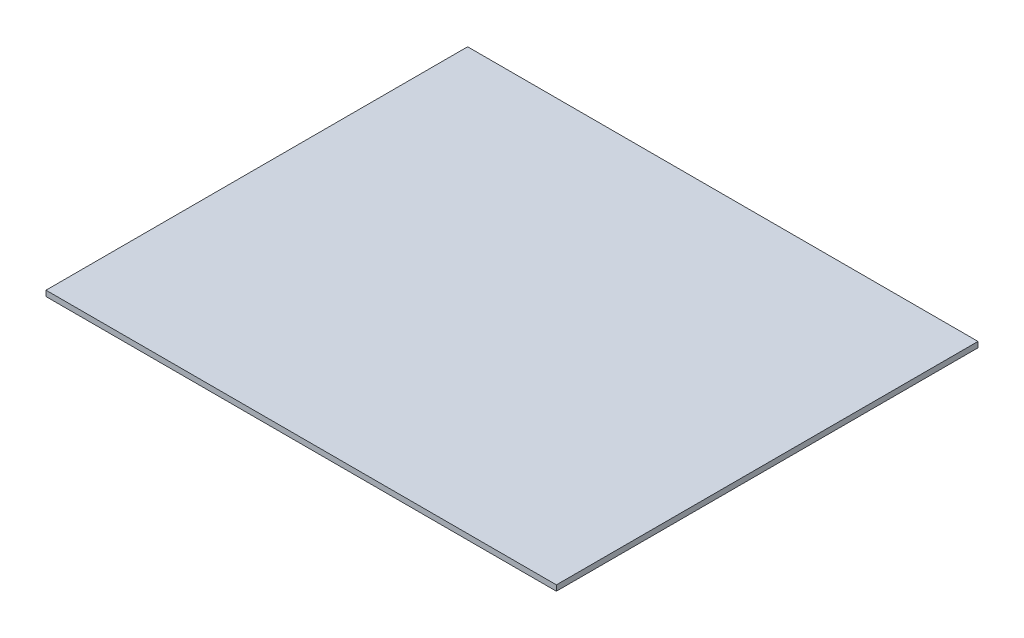
ISO-10303-21;
HEADER;
FILE_DESCRIPTION(('STEP AP214'),'2;1');
FILE_NAME('part.step','',(''),(''),'','','');
FILE_SCHEMA(('AUTOMOTIVE_DESIGN { 1 0 10303 214 1 1 1 1 }'));
ENDSEC;
DATA;
#1=APPLICATION_CONTEXT('core data for automotive mechanical design processes');
#2=APPLICATION_PROTOCOL_DEFINITION('international standard','automotive_design',2000,#1);
#3=PRODUCT_CONTEXT('',#1,'mechanical');
#4=PRODUCT('Part','Part','',(#3));
#5=PRODUCT_RELATED_PRODUCT_CATEGORY('part','',(#4));
#6=PRODUCT_DEFINITION_FORMATION('','',#4);
#7=PRODUCT_DEFINITION_CONTEXT('part definition',#1,'design');
#8=PRODUCT_DEFINITION('design','',#6,#7);
#9=PRODUCT_DEFINITION_SHAPE('','',#8);
#10=(LENGTH_UNIT() NAMED_UNIT(*) SI_UNIT(.MILLI.,.METRE.));
#11=(NAMED_UNIT(*) PLANE_ANGLE_UNIT() SI_UNIT($,.RADIAN.));
#12=(NAMED_UNIT(*) SI_UNIT($,.STERADIAN.) SOLID_ANGLE_UNIT());
#13=UNCERTAINTY_MEASURE_WITH_UNIT(LENGTH_MEASURE(1.E-05),#10,'distance_accuracy_value','');
#14=(GEOMETRIC_REPRESENTATION_CONTEXT(3) GLOBAL_UNCERTAINTY_ASSIGNED_CONTEXT((#13)) GLOBAL_UNIT_ASSIGNED_CONTEXT((#10,
#11,#12)) REPRESENTATION_CONTEXT('',''));
#15=CARTESIAN_POINT('',(0.,0.,0.));
#16=DIRECTION('',(0.,0.,1.));
#17=DIRECTION('',(1.,0.,0.));
#18=AXIS2_PLACEMENT_3D('',#15,#16,#17);
#19=CARTESIAN_POINT('',(230.,-5.,100.));
#20=DIRECTION('',(-1.,0.,0.));
#21=DIRECTION('',(0.,0.,1.));
#22=AXIS2_PLACEMENT_3D('',#19,#20,#21);
#23=PLANE('',#22);
#24=DIRECTION('',(0.,1.,0.));
#25=VECTOR('',#24,1.);
#26=CARTESIAN_POINT('',(230.,-5.,-280.));
#27=LINE('',#26,#25);
#28=CARTESIAN_POINT('',(230.,-5.,-280.));
#29=VERTEX_POINT('',#28);
#30=CARTESIAN_POINT('',(230.,0.,-280.));
#31=VERTEX_POINT('',#30);
#32=EDGE_CURVE('E98',#29,#31,#27,.T.);
#33=ORIENTED_EDGE('',*,*,#32,.T.);
#34=DIRECTION('',(0.,0.,-1.));
#35=VECTOR('',#34,1.);
#36=CARTESIAN_POINT('',(230.,0.,100.));
#37=LINE('',#36,#35);
#38=CARTESIAN_POINT('',(230.,0.,100.));
#39=VERTEX_POINT('',#38);
#40=EDGE_CURVE('E11',#39,#31,#37,.T.);
#41=ORIENTED_EDGE('',*,*,#40,.F.);
#42=DIRECTION('',(0.,1.,0.));
#43=VECTOR('',#42,1.);
#44=CARTESIAN_POINT('',(230.,-5.,100.));
#45=LINE('',#44,#43);
#46=CARTESIAN_POINT('',(230.,-5.,100.));
#47=VERTEX_POINT('',#46);
#48=EDGE_CURVE('E86',#47,#39,#45,.T.);
#49=ORIENTED_EDGE('',*,*,#48,.F.);
#50=DIRECTION('',(0.,0.,-1.));
#51=VECTOR('',#50,1.);
#52=CARTESIAN_POINT('',(230.,-5.,100.));
#53=LINE('',#52,#51);
#54=EDGE_CURVE('E94',#47,#29,#53,.T.);
#55=ORIENTED_EDGE('',*,*,#54,.T.);
#56=EDGE_LOOP('',(#33,#41,#49,#55));
#57=FACE_BOUND('',#56,.T.);
#58=ADVANCED_FACE('F35',(#57),#23,.F.);
#59=CARTESIAN_POINT('',(-230.,0.,100.));
#60=DIRECTION('',(0.,-1.,0.));
#61=DIRECTION('',(0.,0.,-1.));
#62=AXIS2_PLACEMENT_3D('',#59,#60,#61);
#63=PLANE('',#62);
#64=DIRECTION('',(-1.,0.,0.));
#65=VECTOR('',#64,1.);
#66=CARTESIAN_POINT('',(-230.,0.,-280.));
#67=LINE('',#66,#65);
#68=CARTESIAN_POINT('',(-230.,0.,-280.));
#69=VERTEX_POINT('',#68);
#70=EDGE_CURVE('E90',#31,#69,#67,.T.);
#71=ORIENTED_EDGE('',*,*,#70,.T.);
#72=DIRECTION('',(0.,0.,-1.));
#73=VECTOR('',#72,1.);
#74=CARTESIAN_POINT('',(-230.,0.,100.));
#75=LINE('',#74,#73);
#76=CARTESIAN_POINT('',(-230.,0.,100.));
#77=VERTEX_POINT('',#76);
#78=EDGE_CURVE('E43',#77,#69,#75,.T.);
#79=ORIENTED_EDGE('',*,*,#78,.F.);
#80=DIRECTION('',(-1.,0.,0.));
#81=VECTOR('',#80,1.);
#82=CARTESIAN_POINT('',(-230.,0.,100.));
#83=LINE('',#82,#81);
#84=EDGE_CURVE('E81',#39,#77,#83,.T.);
#85=ORIENTED_EDGE('',*,*,#84,.F.);
#86=ORIENTED_EDGE('',*,*,#40,.T.);
#87=EDGE_LOOP('',(#71,#79,#85,#86));
#88=FACE_BOUND('',#87,.T.);
#89=ADVANCED_FACE('F89',(#88),#63,.F.);
#90=CARTESIAN_POINT('',(-230.,-5.,100.));
#91=DIRECTION('',(1.,0.,0.));
#92=DIRECTION('',(0.,0.,-1.));
#93=AXIS2_PLACEMENT_3D('',#90,#91,#92);
#94=PLANE('',#93);
#95=DIRECTION('',(0.,-1.,0.));
#96=VECTOR('',#95,1.);
#97=CARTESIAN_POINT('',(-230.,-5.,-280.));
#98=LINE('',#97,#96);
#99=CARTESIAN_POINT('',(-230.,-5.,-280.));
#100=VERTEX_POINT('',#99);
#101=EDGE_CURVE('E68',#69,#100,#98,.T.);
#102=ORIENTED_EDGE('',*,*,#101,.T.);
#103=DIRECTION('',(0.,0.,-1.));
#104=VECTOR('',#103,1.);
#105=CARTESIAN_POINT('',(-230.,-5.,100.));
#106=LINE('',#105,#104);
#107=CARTESIAN_POINT('',(-230.,-5.,100.));
#108=VERTEX_POINT('',#107);
#109=EDGE_CURVE('E91',#108,#100,#106,.T.);
#110=ORIENTED_EDGE('',*,*,#109,.F.);
#111=DIRECTION('',(0.,-1.,0.));
#112=VECTOR('',#111,1.);
#113=CARTESIAN_POINT('',(-230.,-5.,100.));
#114=LINE('',#113,#112);
#115=EDGE_CURVE('E84',#77,#108,#114,.T.);
#116=ORIENTED_EDGE('',*,*,#115,.F.);
#117=ORIENTED_EDGE('',*,*,#78,.T.);
#118=EDGE_LOOP('',(#102,#110,#116,#117));
#119=FACE_BOUND('',#118,.T.);
#120=ADVANCED_FACE('F92',(#119),#94,.F.);
#121=CARTESIAN_POINT('',(-230.,-5.,100.));
#122=DIRECTION('',(0.,1.,0.));
#123=DIRECTION('',(0.,0.,1.));
#124=AXIS2_PLACEMENT_3D('',#121,#122,#123);
#125=PLANE('',#124);
#126=DIRECTION('',(1.,0.,0.));
#127=VECTOR('',#126,1.);
#128=CARTESIAN_POINT('',(-230.,-5.,-280.));
#129=LINE('',#128,#127);
#130=EDGE_CURVE('E74',#100,#29,#129,.T.);
#131=ORIENTED_EDGE('',*,*,#130,.T.);
#132=ORIENTED_EDGE('',*,*,#54,.F.);
#133=DIRECTION('',(1.,0.,0.));
#134=VECTOR('',#133,1.);
#135=CARTESIAN_POINT('',(-230.,-5.,100.));
#136=LINE('',#135,#134);
#137=EDGE_CURVE('E51',#108,#47,#136,.T.);
#138=ORIENTED_EDGE('',*,*,#137,.F.);
#139=ORIENTED_EDGE('',*,*,#109,.T.);
#140=EDGE_LOOP('',(#131,#132,#138,#139));
#141=FACE_BOUND('',#140,.T.);
#142=ADVANCED_FACE('F105',(#141),#125,.F.);
#143=CARTESIAN_POINT('',(0.,0.,100.));
#144=DIRECTION('',(0.,0.,-1.));
#145=DIRECTION('',(-1.,0.,0.));
#146=AXIS2_PLACEMENT_3D('',#143,#144,#145);
#147=PLANE('',#146);
#148=ORIENTED_EDGE('',*,*,#48,.T.);
#149=ORIENTED_EDGE('',*,*,#84,.T.);
#150=ORIENTED_EDGE('',*,*,#115,.T.);
#151=ORIENTED_EDGE('',*,*,#137,.T.);
#152=EDGE_LOOP('',(#148,#149,#150,#151));
#153=FACE_BOUND('',#152,.T.);
#154=ADVANCED_FACE('F82',(#153),#147,.F.);
#155=CARTESIAN_POINT('',(0.,0.,-280.));
#156=DIRECTION('',(0.,0.,-1.));
#157=DIRECTION('',(-1.,0.,0.));
#158=AXIS2_PLACEMENT_3D('',#155,#156,#157);
#159=PLANE('',#158);
#160=ORIENTED_EDGE('',*,*,#32,.F.);
#161=ORIENTED_EDGE('',*,*,#130,.F.);
#162=ORIENTED_EDGE('',*,*,#101,.F.);
#163=ORIENTED_EDGE('',*,*,#70,.F.);
#164=EDGE_LOOP('',(#160,#161,#162,#163));
#165=FACE_BOUND('',#164,.T.);
#166=ADVANCED_FACE('F108',(#165),#159,.T.);
#167=CLOSED_SHELL('',(#58,#89,#120,#142,#154,#166));
#168=MANIFOLD_SOLID_BREP('B2',#167);
#169=ADVANCED_BREP_SHAPE_REPRESENTATION('',(#18,#168),#14);
#170=SHAPE_DEFINITION_REPRESENTATION(#9,#169);
ENDSEC;
END-ISO-10303-21;
